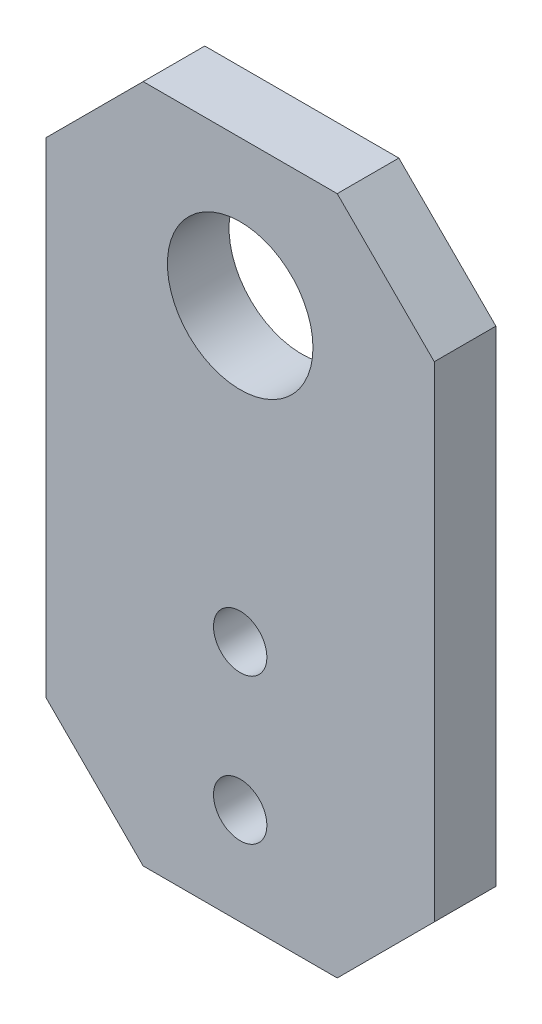
ISO-10303-21;
HEADER;
FILE_DESCRIPTION(('STEP AP214'),'2;1');
FILE_NAME('part.step','',(''),(''),'','','');
FILE_SCHEMA(('AUTOMOTIVE_DESIGN { 1 0 10303 214 1 1 1 1 }'));
ENDSEC;
DATA;
#1=APPLICATION_CONTEXT('core data for automotive mechanical design processes');
#2=APPLICATION_PROTOCOL_DEFINITION('international standard','automotive_design',2000,#1);
#3=PRODUCT_CONTEXT('',#1,'mechanical');
#4=PRODUCT('Part','Part','',(#3));
#5=PRODUCT_RELATED_PRODUCT_CATEGORY('part','',(#4));
#6=PRODUCT_DEFINITION_FORMATION('','',#4);
#7=PRODUCT_DEFINITION_CONTEXT('part definition',#1,'design');
#8=PRODUCT_DEFINITION('design','',#6,#7);
#9=PRODUCT_DEFINITION_SHAPE('','',#8);
#10=(LENGTH_UNIT() NAMED_UNIT(*) SI_UNIT(.MILLI.,.METRE.));
#11=(NAMED_UNIT(*) PLANE_ANGLE_UNIT() SI_UNIT($,.RADIAN.));
#12=(NAMED_UNIT(*) SI_UNIT($,.STERADIAN.) SOLID_ANGLE_UNIT());
#13=UNCERTAINTY_MEASURE_WITH_UNIT(LENGTH_MEASURE(1.E-05),#10,'distance_accuracy_value','');
#14=(GEOMETRIC_REPRESENTATION_CONTEXT(3) GLOBAL_UNCERTAINTY_ASSIGNED_CONTEXT((#13)) GLOBAL_UNIT_ASSIGNED_CONTEXT((#10,
#11,#12)) REPRESENTATION_CONTEXT('',''));
#15=CARTESIAN_POINT('',(0.,0.,0.));
#16=DIRECTION('',(0.,0.,1.));
#17=DIRECTION('',(1.,0.,0.));
#18=AXIS2_PLACEMENT_3D('',#15,#16,#17);
#19=CARTESIAN_POINT('',(0.,0.,6.35));
#20=DIRECTION('',(0.,0.,-1.));
#21=DIRECTION('',(-1.,0.,0.));
#22=AXIS2_PLACEMENT_3D('',#19,#20,#21);
#23=PLANE('',#22);
#24=CARTESIAN_POINT('',(0.,-10.,6.35));
#25=DIRECTION('',(0.,0.,1.));
#26=DIRECTION('',(1.,0.,0.));
#27=AXIS2_PLACEMENT_3D('',#24,#25,#26);
#28=CIRCLE('',#27,2.75);
#29=CARTESIAN_POINT('',(2.75,-10.,6.35));
#30=VERTEX_POINT('',#29);
#31=EDGE_CURVE('E229',#30,#30,#28,.T.);
#32=ORIENTED_EDGE('',*,*,#31,.F.);
#33=EDGE_LOOP('',(#32));
#34=FACE_BOUND('',#33,.T.);
#35=CARTESIAN_POINT('',(0.,-25.,6.35));
#36=DIRECTION('',(0.,0.,1.));
#37=DIRECTION('',(1.,0.,0.));
#38=AXIS2_PLACEMENT_3D('',#35,#36,#37);
#39=CIRCLE('',#38,2.75);
#40=CARTESIAN_POINT('',(2.75000000000001,-25.,6.35));
#41=VERTEX_POINT('',#40);
#42=EDGE_CURVE('E221',#41,#41,#39,.T.);
#43=ORIENTED_EDGE('',*,*,#42,.F.);
#44=EDGE_LOOP('',(#43));
#45=FACE_BOUND('',#44,.T.);
#46=DIRECTION('',(1.,0.,0.));
#47=VECTOR('',#46,1.);
#48=CARTESIAN_POINT('',(-20.,-35.,6.35));
#49=LINE('',#48,#47);
#50=CARTESIAN_POINT('',(-10.,-35.,6.35));
#51=VERTEX_POINT('',#50);
#52=CARTESIAN_POINT('',(9.99999999999997,-35.,6.35));
#53=VERTEX_POINT('',#52);
#54=EDGE_CURVE('E192',#51,#53,#49,.T.);
#55=ORIENTED_EDGE('',*,*,#54,.T.);
#56=DIRECTION('',(-0.707106781186549,-0.707106781186546,0.));
#57=VECTOR('',#56,1.);
#58=CARTESIAN_POINT('',(20.,-25.,6.35));
#59=LINE('',#58,#57);
#60=CARTESIAN_POINT('',(20.,-25.,6.35));
#61=VERTEX_POINT('',#60);
#62=EDGE_CURVE('E178',#53,#61,#59,.F.);
#63=ORIENTED_EDGE('',*,*,#62,.T.);
#64=DIRECTION('',(0.,1.,0.));
#65=VECTOR('',#64,1.);
#66=CARTESIAN_POINT('',(20.,-35.,6.35));
#67=LINE('',#66,#65);
#68=CARTESIAN_POINT('',(20.,24.9999999999999,6.35));
#69=VERTEX_POINT('',#68);
#70=EDGE_CURVE('E135',#61,#69,#67,.T.);
#71=ORIENTED_EDGE('',*,*,#70,.T.);
#72=DIRECTION('',(0.707106781186546,-0.707106781186549,0.));
#73=VECTOR('',#72,1.);
#74=CARTESIAN_POINT('',(9.99999999999999,35.,6.35));
#75=LINE('',#74,#73);
#76=CARTESIAN_POINT('',(9.99999999999999,35.,6.35));
#77=VERTEX_POINT('',#76);
#78=EDGE_CURVE('E70',#69,#77,#75,.F.);
#79=ORIENTED_EDGE('',*,*,#78,.T.);
#80=DIRECTION('',(-1.,0.,0.));
#81=VECTOR('',#80,1.);
#82=CARTESIAN_POINT('',(-20.,35.,6.35));
#83=LINE('',#82,#81);
#84=CARTESIAN_POINT('',(-9.99999999999995,35.,6.35));
#85=VERTEX_POINT('',#84);
#86=EDGE_CURVE('E157',#77,#85,#83,.T.);
#87=ORIENTED_EDGE('',*,*,#86,.T.);
#88=DIRECTION('',(0.707106781186549,0.707106781186546,0.));
#89=VECTOR('',#88,1.);
#90=CARTESIAN_POINT('',(-20.,25.,6.35));
#91=LINE('',#90,#89);
#92=CARTESIAN_POINT('',(-20.,25.,6.35));
#93=VERTEX_POINT('',#92);
#94=EDGE_CURVE('E170',#85,#93,#91,.F.);
#95=ORIENTED_EDGE('',*,*,#94,.T.);
#96=DIRECTION('',(0.,-1.,0.));
#97=VECTOR('',#96,1.);
#98=CARTESIAN_POINT('',(-20.,-35.,6.35));
#99=LINE('',#98,#97);
#100=CARTESIAN_POINT('',(-20.,-25.,6.35));
#101=VERTEX_POINT('',#100);
#102=EDGE_CURVE('E150',#93,#101,#99,.T.);
#103=ORIENTED_EDGE('',*,*,#102,.T.);
#104=DIRECTION('',(-0.707106781186546,0.707106781186549,0.));
#105=VECTOR('',#104,1.);
#106=CARTESIAN_POINT('',(-9.99999999999999,-35.,6.35));
#107=LINE('',#106,#105);
#108=EDGE_CURVE('E175',#101,#51,#107,.F.);
#109=ORIENTED_EDGE('',*,*,#108,.T.);
#110=EDGE_LOOP('',(#55,#63,#71,#79,#87,#95,#103,#109));
#111=FACE_BOUND('',#110,.T.);
#112=CARTESIAN_POINT('',(0.,20.,6.35));
#113=DIRECTION('',(0.,0.,1.));
#114=DIRECTION('',(1.,0.,0.));
#115=AXIS2_PLACEMENT_3D('',#112,#113,#114);
#116=CIRCLE('',#115,7.5);
#117=CARTESIAN_POINT('',(7.5,20.,6.35));
#118=VERTEX_POINT('',#117);
#119=EDGE_CURVE('E206',#118,#118,#116,.T.);
#120=ORIENTED_EDGE('',*,*,#119,.F.);
#121=EDGE_LOOP('',(#120));
#122=FACE_BOUND('',#121,.T.);
#123=ADVANCED_FACE('F47',(#34,#45,#111,#122),#23,.F.);
#124=CARTESIAN_POINT('',(0.,0.,0.));
#125=DIRECTION('',(0.,0.,-1.));
#126=DIRECTION('',(-1.,0.,0.));
#127=AXIS2_PLACEMENT_3D('',#124,#125,#126);
#128=PLANE('',#127);
#129=CARTESIAN_POINT('',(0.,-10.,0.));
#130=DIRECTION('',(0.,0.,1.));
#131=DIRECTION('',(1.,0.,0.));
#132=AXIS2_PLACEMENT_3D('',#129,#130,#131);
#133=CIRCLE('',#132,2.75);
#134=CARTESIAN_POINT('',(2.75,-10.,0.));
#135=VERTEX_POINT('',#134);
#136=EDGE_CURVE('E225',#135,#135,#133,.T.);
#137=ORIENTED_EDGE('',*,*,#136,.T.);
#138=EDGE_LOOP('',(#137));
#139=FACE_BOUND('',#138,.T.);
#140=CARTESIAN_POINT('',(0.,-25.,0.));
#141=DIRECTION('',(0.,0.,1.));
#142=DIRECTION('',(1.,0.,0.));
#143=AXIS2_PLACEMENT_3D('',#140,#141,#142);
#144=CIRCLE('',#143,2.75);
#145=CARTESIAN_POINT('',(2.75,-25.,0.));
#146=VERTEX_POINT('',#145);
#147=EDGE_CURVE('E216',#146,#146,#144,.T.);
#148=ORIENTED_EDGE('',*,*,#147,.T.);
#149=EDGE_LOOP('',(#148));
#150=FACE_BOUND('',#149,.T.);
#151=DIRECTION('',(0.,1.,0.));
#152=VECTOR('',#151,1.);
#153=CARTESIAN_POINT('',(20.,-35.,0.));
#154=LINE('',#153,#152);
#155=CARTESIAN_POINT('',(20.,-25.,0.));
#156=VERTEX_POINT('',#155);
#157=CARTESIAN_POINT('',(20.,24.9999999999999,0.));
#158=VERTEX_POINT('',#157);
#159=EDGE_CURVE('E133',#156,#158,#154,.T.);
#160=ORIENTED_EDGE('',*,*,#159,.F.);
#161=DIRECTION('',(0.707106781186549,0.707106781186546,0.));
#162=VECTOR('',#161,1.);
#163=CARTESIAN_POINT('',(22.5,-22.5,0.));
#164=LINE('',#163,#162);
#165=CARTESIAN_POINT('',(9.99999999999997,-35.,0.));
#166=VERTEX_POINT('',#165);
#167=EDGE_CURVE('E115',#156,#166,#164,.F.);
#168=ORIENTED_EDGE('',*,*,#167,.T.);
#169=DIRECTION('',(1.,0.,0.));
#170=VECTOR('',#169,1.);
#171=CARTESIAN_POINT('',(-20.,-35.,0.));
#172=LINE('',#171,#170);
#173=CARTESIAN_POINT('',(-10.,-35.,0.));
#174=VERTEX_POINT('',#173);
#175=EDGE_CURVE('E146',#174,#166,#172,.T.);
#176=ORIENTED_EDGE('',*,*,#175,.F.);
#177=DIRECTION('',(0.707106781186546,-0.707106781186549,0.));
#178=VECTOR('',#177,1.);
#179=CARTESIAN_POINT('',(-22.5,-22.4999999999999,0.));
#180=LINE('',#179,#178);
#181=CARTESIAN_POINT('',(-20.,-25.,0.));
#182=VERTEX_POINT('',#181);
#183=EDGE_CURVE('E127',#174,#182,#180,.F.);
#184=ORIENTED_EDGE('',*,*,#183,.T.);
#185=DIRECTION('',(0.,-1.,0.));
#186=VECTOR('',#185,1.);
#187=CARTESIAN_POINT('',(-20.,-35.,0.));
#188=LINE('',#187,#186);
#189=CARTESIAN_POINT('',(-20.,25.,0.));
#190=VERTEX_POINT('',#189);
#191=EDGE_CURVE('E152',#190,#182,#188,.T.);
#192=ORIENTED_EDGE('',*,*,#191,.F.);
#193=DIRECTION('',(-0.707106781186549,-0.707106781186546,0.));
#194=VECTOR('',#193,1.);
#195=CARTESIAN_POINT('',(-22.5,22.5,0.));
#196=LINE('',#195,#194);
#197=CARTESIAN_POINT('',(-9.99999999999995,35.,0.));
#198=VERTEX_POINT('',#197);
#199=EDGE_CURVE('E137',#190,#198,#196,.F.);
#200=ORIENTED_EDGE('',*,*,#199,.T.);
#201=DIRECTION('',(-1.,0.,0.));
#202=VECTOR('',#201,1.);
#203=CARTESIAN_POINT('',(-20.,35.,0.));
#204=LINE('',#203,#202);
#205=CARTESIAN_POINT('',(9.99999999999999,35.,0.));
#206=VERTEX_POINT('',#205);
#207=EDGE_CURVE('E145',#206,#198,#204,.T.);
#208=ORIENTED_EDGE('',*,*,#207,.F.);
#209=DIRECTION('',(-0.707106781186546,0.707106781186549,0.));
#210=VECTOR('',#209,1.);
#211=CARTESIAN_POINT('',(22.5,22.4999999999999,0.));
#212=LINE('',#211,#210);
#213=EDGE_CURVE('E143',#206,#158,#212,.F.);
#214=ORIENTED_EDGE('',*,*,#213,.T.);
#215=EDGE_LOOP('',(#160,#168,#176,#184,#192,#200,#208,#214));
#216=FACE_BOUND('',#215,.T.);
#217=CARTESIAN_POINT('',(0.,20.,0.));
#218=DIRECTION('',(0.,0.,1.));
#219=DIRECTION('',(1.,0.,0.));
#220=AXIS2_PLACEMENT_3D('',#217,#218,#219);
#221=CIRCLE('',#220,7.5);
#222=CARTESIAN_POINT('',(7.5,20.,0.));
#223=VERTEX_POINT('',#222);
#224=EDGE_CURVE('E202',#223,#223,#221,.T.);
#225=ORIENTED_EDGE('',*,*,#224,.T.);
#226=EDGE_LOOP('',(#225));
#227=FACE_BOUND('',#226,.T.);
#228=ADVANCED_FACE('F140',(#139,#150,#216,#227),#128,.T.);
#229=CARTESIAN_POINT('',(-20.,-35.,6.35));
#230=DIRECTION('',(1.,0.,0.));
#231=DIRECTION('',(0.,0.,-1.));
#232=AXIS2_PLACEMENT_3D('',#229,#230,#231);
#233=PLANE('',#232);
#234=ORIENTED_EDGE('',*,*,#191,.T.);
#235=DIRECTION('',(0.,0.,1.));
#236=VECTOR('',#235,1.);
#237=CARTESIAN_POINT('',(-20.,-25.,6.35));
#238=LINE('',#237,#236);
#239=EDGE_CURVE('E185',#182,#101,#238,.T.);
#240=ORIENTED_EDGE('',*,*,#239,.T.);
#241=ORIENTED_EDGE('',*,*,#102,.F.);
#242=DIRECTION('',(0.,0.,-1.));
#243=VECTOR('',#242,1.);
#244=CARTESIAN_POINT('',(-20.,25.,6.35));
#245=LINE('',#244,#243);
#246=EDGE_CURVE('E181',#93,#190,#245,.T.);
#247=ORIENTED_EDGE('',*,*,#246,.T.);
#248=EDGE_LOOP('',(#234,#240,#241,#247));
#249=FACE_BOUND('',#248,.T.);
#250=ADVANCED_FACE('F252',(#249),#233,.F.);
#251=CARTESIAN_POINT('',(-20.,-35.,6.35));
#252=DIRECTION('',(0.,1.,0.));
#253=DIRECTION('',(-1.,0.,0.));
#254=AXIS2_PLACEMENT_3D('',#251,#252,#253);
#255=PLANE('',#254);
#256=ORIENTED_EDGE('',*,*,#175,.T.);
#257=DIRECTION('',(0.,0.,1.));
#258=VECTOR('',#257,1.);
#259=CARTESIAN_POINT('',(9.99999999999997,-35.,6.35));
#260=LINE('',#259,#258);
#261=EDGE_CURVE('E120',#166,#53,#260,.T.);
#262=ORIENTED_EDGE('',*,*,#261,.T.);
#263=ORIENTED_EDGE('',*,*,#54,.F.);
#264=DIRECTION('',(0.,0.,-1.));
#265=VECTOR('',#264,1.);
#266=CARTESIAN_POINT('',(-10.,-35.,6.35));
#267=LINE('',#266,#265);
#268=EDGE_CURVE('E126',#51,#174,#267,.T.);
#269=ORIENTED_EDGE('',*,*,#268,.T.);
#270=EDGE_LOOP('',(#256,#262,#263,#269));
#271=FACE_BOUND('',#270,.T.);
#272=ADVANCED_FACE('F244',(#271),#255,.F.);
#273=CARTESIAN_POINT('',(20.,-35.,6.35));
#274=DIRECTION('',(-1.,0.,0.));
#275=DIRECTION('',(0.,-1.,0.));
#276=AXIS2_PLACEMENT_3D('',#273,#274,#275);
#277=PLANE('',#276);
#278=ORIENTED_EDGE('',*,*,#70,.F.);
#279=DIRECTION('',(0.,0.,-1.));
#280=VECTOR('',#279,1.);
#281=CARTESIAN_POINT('',(20.,-25.,6.35));
#282=LINE('',#281,#280);
#283=EDGE_CURVE('E119',#61,#156,#282,.T.);
#284=ORIENTED_EDGE('',*,*,#283,.T.);
#285=ORIENTED_EDGE('',*,*,#159,.T.);
#286=DIRECTION('',(0.,0.,1.));
#287=VECTOR('',#286,1.);
#288=CARTESIAN_POINT('',(20.,24.9999999999999,6.35));
#289=LINE('',#288,#287);
#290=EDGE_CURVE('E138',#158,#69,#289,.T.);
#291=ORIENTED_EDGE('',*,*,#290,.T.);
#292=EDGE_LOOP('',(#278,#284,#285,#291));
#293=FACE_BOUND('',#292,.T.);
#294=ADVANCED_FACE('F132',(#293),#277,.F.);
#295=CARTESIAN_POINT('',(-20.,35.,6.35));
#296=DIRECTION('',(0.,-1.,0.));
#297=DIRECTION('',(0.,0.,-1.));
#298=AXIS2_PLACEMENT_3D('',#295,#296,#297);
#299=PLANE('',#298);
#300=ORIENTED_EDGE('',*,*,#86,.F.);
#301=DIRECTION('',(0.,0.,-1.));
#302=VECTOR('',#301,1.);
#303=CARTESIAN_POINT('',(9.99999999999999,35.,6.35));
#304=LINE('',#303,#302);
#305=EDGE_CURVE('E11',#77,#206,#304,.T.);
#306=ORIENTED_EDGE('',*,*,#305,.T.);
#307=ORIENTED_EDGE('',*,*,#207,.T.);
#308=DIRECTION('',(0.,0.,1.));
#309=VECTOR('',#308,1.);
#310=CARTESIAN_POINT('',(-9.99999999999995,35.,6.35));
#311=LINE('',#310,#309);
#312=EDGE_CURVE('E57',#198,#85,#311,.T.);
#313=ORIENTED_EDGE('',*,*,#312,.T.);
#314=EDGE_LOOP('',(#300,#306,#307,#313));
#315=FACE_BOUND('',#314,.T.);
#316=ADVANCED_FACE('F249',(#315),#299,.F.);
#317=CARTESIAN_POINT('',(0.,20.,6.35));
#318=DIRECTION('',(0.,0.,-1.));
#319=DIRECTION('',(-1.,0.,0.));
#320=AXIS2_PLACEMENT_3D('',#317,#318,#319);
#321=CYLINDRICAL_SURFACE('',#320,7.5);
#322=ORIENTED_EDGE('',*,*,#119,.T.);
#323=EDGE_LOOP('',(#322));
#324=FACE_BOUND('',#323,.T.);
#325=ORIENTED_EDGE('',*,*,#224,.F.);
#326=EDGE_LOOP('',(#325));
#327=FACE_BOUND('',#326,.T.);
#328=ADVANCED_FACE('F314',(#324,#327),#321,.F.);
#329=CARTESIAN_POINT('',(0.,-25.,6.35));
#330=DIRECTION('',(0.,0.,1.));
#331=DIRECTION('',(1.,0.,0.));
#332=AXIS2_PLACEMENT_3D('',#329,#330,#331);
#333=CYLINDRICAL_SURFACE('',#332,2.75);
#334=ORIENTED_EDGE('',*,*,#147,.F.);
#335=EDGE_LOOP('',(#334));
#336=FACE_BOUND('',#335,.T.);
#337=ORIENTED_EDGE('',*,*,#42,.T.);
#338=EDGE_LOOP('',(#337));
#339=FACE_BOUND('',#338,.T.);
#340=ADVANCED_FACE('F352',(#336,#339),#333,.F.);
#341=CARTESIAN_POINT('',(0.,-10.,6.35));
#342=DIRECTION('',(0.,0.,1.));
#343=DIRECTION('',(1.,0.,0.));
#344=AXIS2_PLACEMENT_3D('',#341,#342,#343);
#345=CYLINDRICAL_SURFACE('',#344,2.75);
#346=ORIENTED_EDGE('',*,*,#136,.F.);
#347=EDGE_LOOP('',(#346));
#348=FACE_BOUND('',#347,.T.);
#349=ORIENTED_EDGE('',*,*,#31,.T.);
#350=EDGE_LOOP('',(#349));
#351=FACE_BOUND('',#350,.T.);
#352=ADVANCED_FACE('F234',(#348,#351),#345,.F.);
#353=CARTESIAN_POINT('',(20.,-25.,6.35));
#354=DIRECTION('',(-0.707106781186546,0.707106781186549,0.));
#355=DIRECTION('',(0.,0.,-1.));
#356=AXIS2_PLACEMENT_3D('',#353,#354,#355);
#357=PLANE('',#356);
#358=ORIENTED_EDGE('',*,*,#62,.F.);
#359=ORIENTED_EDGE('',*,*,#261,.F.);
#360=ORIENTED_EDGE('',*,*,#167,.F.);
#361=ORIENTED_EDGE('',*,*,#283,.F.);
#362=EDGE_LOOP('',(#358,#359,#360,#361));
#363=FACE_BOUND('',#362,.T.);
#364=ADVANCED_FACE('F118',(#363),#357,.F.);
#365=CARTESIAN_POINT('',(-9.99999999999999,-35.,6.35));
#366=DIRECTION('',(0.707106781186549,0.707106781186546,0.));
#367=DIRECTION('',(0.,0.,-1.));
#368=AXIS2_PLACEMENT_3D('',#365,#366,#367);
#369=PLANE('',#368);
#370=ORIENTED_EDGE('',*,*,#108,.F.);
#371=ORIENTED_EDGE('',*,*,#239,.F.);
#372=ORIENTED_EDGE('',*,*,#183,.F.);
#373=ORIENTED_EDGE('',*,*,#268,.F.);
#374=EDGE_LOOP('',(#370,#371,#372,#373));
#375=FACE_BOUND('',#374,.T.);
#376=ADVANCED_FACE('F246',(#375),#369,.F.);
#377=CARTESIAN_POINT('',(9.99999999999999,35.,6.35));
#378=DIRECTION('',(-0.707106781186549,-0.707106781186546,0.));
#379=DIRECTION('',(0.,0.,-1.));
#380=AXIS2_PLACEMENT_3D('',#377,#378,#379);
#381=PLANE('',#380);
#382=ORIENTED_EDGE('',*,*,#78,.F.);
#383=ORIENTED_EDGE('',*,*,#290,.F.);
#384=ORIENTED_EDGE('',*,*,#213,.F.);
#385=ORIENTED_EDGE('',*,*,#305,.F.);
#386=EDGE_LOOP('',(#382,#383,#384,#385));
#387=FACE_BOUND('',#386,.T.);
#388=ADVANCED_FACE('F274',(#387),#381,.F.);
#389=CARTESIAN_POINT('',(-20.,25.,6.35));
#390=DIRECTION('',(0.707106781186546,-0.707106781186549,0.));
#391=DIRECTION('',(0.,0.,-1.));
#392=AXIS2_PLACEMENT_3D('',#389,#390,#391);
#393=PLANE('',#392);
#394=ORIENTED_EDGE('',*,*,#94,.F.);
#395=ORIENTED_EDGE('',*,*,#312,.F.);
#396=ORIENTED_EDGE('',*,*,#199,.F.);
#397=ORIENTED_EDGE('',*,*,#246,.F.);
#398=EDGE_LOOP('',(#394,#395,#396,#397));
#399=FACE_BOUND('',#398,.T.);
#400=ADVANCED_FACE('F50',(#399),#393,.F.);
#401=CLOSED_SHELL('',(#123,#228,#250,#272,#294,#316,#328,#340,#352,#364,#376,#388,#400));
#402=MANIFOLD_SOLID_BREP('B2',#401);
#403=ADVANCED_BREP_SHAPE_REPRESENTATION('',(#18,#402),#14);
#404=SHAPE_DEFINITION_REPRESENTATION(#9,#403);
ENDSEC;
END-ISO-10303-21;
